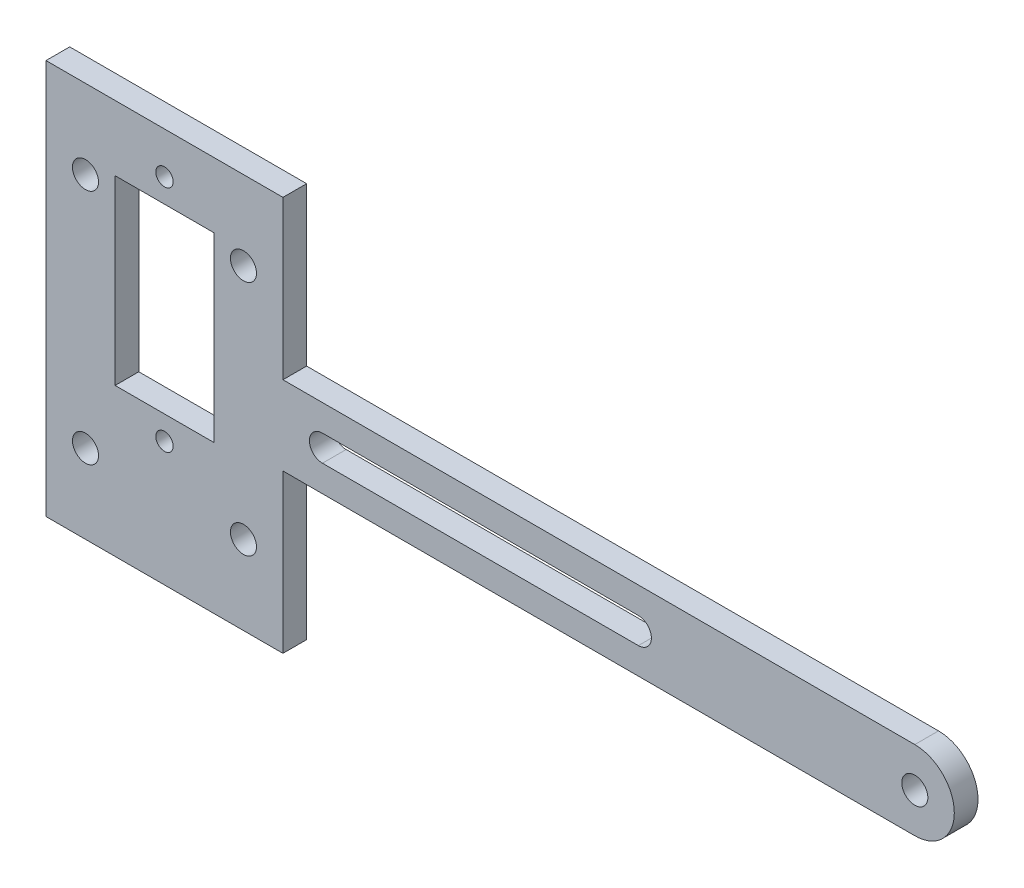
ISO-10303-21;
HEADER;
FILE_DESCRIPTION(('STEP AP214'),'2;1');
FILE_NAME('part.step','',(''),(''),'','','');
FILE_SCHEMA(('AUTOMOTIVE_DESIGN { 1 0 10303 214 1 1 1 1 }'));
ENDSEC;
DATA;
#1=APPLICATION_CONTEXT('core data for automotive mechanical design processes');
#2=APPLICATION_PROTOCOL_DEFINITION('international standard','automotive_design',2000,#1);
#3=PRODUCT_CONTEXT('',#1,'mechanical');
#4=PRODUCT('Part','Part','',(#3));
#5=PRODUCT_RELATED_PRODUCT_CATEGORY('part','',(#4));
#6=PRODUCT_DEFINITION_FORMATION('','',#4);
#7=PRODUCT_DEFINITION_CONTEXT('part definition',#1,'design');
#8=PRODUCT_DEFINITION('design','',#6,#7);
#9=PRODUCT_DEFINITION_SHAPE('','',#8);
#10=(LENGTH_UNIT() NAMED_UNIT(*) SI_UNIT(.MILLI.,.METRE.));
#11=(NAMED_UNIT(*) PLANE_ANGLE_UNIT() SI_UNIT($,.RADIAN.));
#12=(NAMED_UNIT(*) SI_UNIT($,.STERADIAN.) SOLID_ANGLE_UNIT());
#13=UNCERTAINTY_MEASURE_WITH_UNIT(LENGTH_MEASURE(1.E-05),#10,'distance_accuracy_value','');
#14=(GEOMETRIC_REPRESENTATION_CONTEXT(3) GLOBAL_UNCERTAINTY_ASSIGNED_CONTEXT((#13)) GLOBAL_UNIT_ASSIGNED_CONTEXT((#10,
#11,#12)) REPRESENTATION_CONTEXT('',''));
#15=CARTESIAN_POINT('',(0.,0.,0.));
#16=DIRECTION('',(0.,0.,1.));
#17=DIRECTION('',(1.,0.,0.));
#18=AXIS2_PLACEMENT_3D('',#15,#16,#17);
#19=CARTESIAN_POINT('',(95.,0.,3.));
#20=DIRECTION('',(0.,0.,1.));
#21=DIRECTION('',(1.,0.,0.));
#22=AXIS2_PLACEMENT_3D('',#19,#20,#21);
#23=PLANE('',#22);
#24=CARTESIAN_POINT('',(10.,-15.,3.));
#25=DIRECTION('',(0.,0.,1.));
#26=DIRECTION('',(-1.,0.,0.));
#27=AXIS2_PLACEMENT_3D('',#24,#25,#26);
#28=CIRCLE('',#27,1.65);
#29=CARTESIAN_POINT('',(8.35,-15.,3.));
#30=VERTEX_POINT('',#29);
#31=EDGE_CURVE('E431',#30,#30,#28,.T.);
#32=ORIENTED_EDGE('',*,*,#31,.F.);
#33=EDGE_LOOP('',(#32));
#34=FACE_BOUND('',#33,.T.);
#35=CARTESIAN_POINT('',(10.,15.,3.));
#36=DIRECTION('',(0.,0.,1.));
#37=DIRECTION('',(1.,0.,0.));
#38=AXIS2_PLACEMENT_3D('',#35,#36,#37);
#39=CIRCLE('',#38,1.65);
#40=CARTESIAN_POINT('',(11.65,15.,3.));
#41=VERTEX_POINT('',#40);
#42=EDGE_CURVE('E443',#41,#41,#39,.T.);
#43=ORIENTED_EDGE('',*,*,#42,.F.);
#44=EDGE_LOOP('',(#43));
#45=FACE_BOUND('',#44,.T.);
#46=DIRECTION('',(1.,0.,0.));
#47=VECTOR('',#46,1.);
#48=CARTESIAN_POINT('',(20.,-1.65,3.));
#49=LINE('',#48,#47);
#50=CARTESIAN_POINT('',(20.,-1.65,3.));
#51=VERTEX_POINT('',#50);
#52=CARTESIAN_POINT('',(60.,-1.65,3.));
#53=VERTEX_POINT('',#52);
#54=EDGE_CURVE('E158',#51,#53,#49,.T.);
#55=ORIENTED_EDGE('',*,*,#54,.F.);
#56=CARTESIAN_POINT('',(20.,0.,3.));
#57=DIRECTION('',(0.,0.,1.));
#58=DIRECTION('',(-1.,0.,0.));
#59=AXIS2_PLACEMENT_3D('',#56,#57,#58);
#60=CIRCLE('',#59,1.65);
#61=CARTESIAN_POINT('',(20.,1.65,3.));
#62=VERTEX_POINT('',#61);
#63=EDGE_CURVE('E150',#62,#51,#60,.T.);
#64=ORIENTED_EDGE('',*,*,#63,.F.);
#65=DIRECTION('',(-1.,0.,0.));
#66=VECTOR('',#65,1.);
#67=CARTESIAN_POINT('',(20.,1.65,3.));
#68=LINE('',#67,#66);
#69=CARTESIAN_POINT('',(60.,1.65,3.));
#70=VERTEX_POINT('',#69);
#71=EDGE_CURVE('E173',#70,#62,#68,.T.);
#72=ORIENTED_EDGE('',*,*,#71,.F.);
#73=CARTESIAN_POINT('',(60.,0.,3.));
#74=DIRECTION('',(0.,0.,1.));
#75=DIRECTION('',(-1.,0.,0.));
#76=AXIS2_PLACEMENT_3D('',#73,#74,#75);
#77=CIRCLE('',#76,1.65);
#78=EDGE_CURVE('E171',#53,#70,#77,.T.);
#79=ORIENTED_EDGE('',*,*,#78,.F.);
#80=EDGE_LOOP('',(#55,#64,#72,#79));
#81=FACE_BOUND('',#80,.T.);
#82=CARTESIAN_POINT('',(0.,19.75,3.));
#83=DIRECTION('',(0.,0.,1.));
#84=DIRECTION('',(1.,0.,0.));
#85=AXIS2_PLACEMENT_3D('',#82,#83,#84);
#86=CIRCLE('',#85,1.1);
#87=CARTESIAN_POINT('',(1.1,19.75,3.));
#88=VERTEX_POINT('',#87);
#89=EDGE_CURVE('E189',#88,#88,#86,.T.);
#90=ORIENTED_EDGE('',*,*,#89,.F.);
#91=EDGE_LOOP('',(#90));
#92=FACE_BOUND('',#91,.T.);
#93=DIRECTION('',(0.,1.,0.));
#94=VECTOR('',#93,1.);
#95=CARTESIAN_POINT('',(6.25,-6.25,3.));
#96=LINE('',#95,#94);
#97=CARTESIAN_POINT('',(6.25,-6.25,3.));
#98=VERTEX_POINT('',#97);
#99=CARTESIAN_POINT('',(6.25,16.75,3.));
#100=VERTEX_POINT('',#99);
#101=EDGE_CURVE('E203',#98,#100,#96,.T.);
#102=ORIENTED_EDGE('',*,*,#101,.F.);
#103=DIRECTION('',(1.,0.,0.));
#104=VECTOR('',#103,1.);
#105=CARTESIAN_POINT('',(-6.25,-6.25,3.));
#106=LINE('',#105,#104);
#107=CARTESIAN_POINT('',(-6.25,-6.25,3.));
#108=VERTEX_POINT('',#107);
#109=EDGE_CURVE('E201',#108,#98,#106,.T.);
#110=ORIENTED_EDGE('',*,*,#109,.F.);
#111=DIRECTION('',(0.,-1.,0.));
#112=VECTOR('',#111,1.);
#113=CARTESIAN_POINT('',(-6.25,16.75,3.));
#114=LINE('',#113,#112);
#115=CARTESIAN_POINT('',(-6.25000000000001,16.75,3.));
#116=VERTEX_POINT('',#115);
#117=EDGE_CURVE('E209',#116,#108,#114,.T.);
#118=ORIENTED_EDGE('',*,*,#117,.F.);
#119=DIRECTION('',(-1.,0.,0.));
#120=VECTOR('',#119,1.);
#121=CARTESIAN_POINT('',(6.25,16.75,3.));
#122=LINE('',#121,#120);
#123=EDGE_CURVE('E206',#100,#116,#122,.T.);
#124=ORIENTED_EDGE('',*,*,#123,.F.);
#125=EDGE_LOOP('',(#102,#110,#118,#124));
#126=FACE_BOUND('',#125,.T.);
#127=DIRECTION('',(1.,0.,0.));
#128=VECTOR('',#127,1.);
#129=CARTESIAN_POINT('',(-15.,-25.,3.));
#130=LINE('',#129,#128);
#131=CARTESIAN_POINT('',(-15.,-25.,3.));
#132=VERTEX_POINT('',#131);
#133=CARTESIAN_POINT('',(15.,-25.,3.));
#134=VERTEX_POINT('',#133);
#135=EDGE_CURVE('E232',#132,#134,#130,.T.);
#136=ORIENTED_EDGE('',*,*,#135,.T.);
#137=DIRECTION('',(0.,1.,0.));
#138=VECTOR('',#137,1.);
#139=CARTESIAN_POINT('',(15.,-25.,3.));
#140=LINE('',#139,#138);
#141=CARTESIAN_POINT('',(15.,-5.,3.));
#142=VERTEX_POINT('',#141);
#143=EDGE_CURVE('E235',#134,#142,#140,.T.);
#144=ORIENTED_EDGE('',*,*,#143,.T.);
#145=DIRECTION('',(1.,0.,0.));
#146=VECTOR('',#145,1.);
#147=CARTESIAN_POINT('',(15.,-5.,3.));
#148=LINE('',#147,#146);
#149=CARTESIAN_POINT('',(95.,-5.,3.));
#150=VERTEX_POINT('',#149);
#151=EDGE_CURVE('E238',#142,#150,#148,.T.);
#152=ORIENTED_EDGE('',*,*,#151,.T.);
#153=CARTESIAN_POINT('',(95.,0.,3.));
#154=DIRECTION('',(0.,0.,1.));
#155=DIRECTION('',(1.,0.,0.));
#156=AXIS2_PLACEMENT_3D('',#153,#154,#155);
#157=CIRCLE('',#156,5.);
#158=CARTESIAN_POINT('',(95.,5.,3.));
#159=VERTEX_POINT('',#158);
#160=EDGE_CURVE('E240',#150,#159,#157,.T.);
#161=ORIENTED_EDGE('',*,*,#160,.T.);
#162=DIRECTION('',(-1.,0.,0.));
#163=VECTOR('',#162,1.);
#164=CARTESIAN_POINT('',(95.,5.,3.));
#165=LINE('',#164,#163);
#166=CARTESIAN_POINT('',(15.,5.,3.));
#167=VERTEX_POINT('',#166);
#168=EDGE_CURVE('E242',#159,#167,#165,.T.);
#169=ORIENTED_EDGE('',*,*,#168,.T.);
#170=DIRECTION('',(0.,1.,0.));
#171=VECTOR('',#170,1.);
#172=CARTESIAN_POINT('',(15.,5.,3.));
#173=LINE('',#172,#171);
#174=CARTESIAN_POINT('',(15.,25.,3.));
#175=VERTEX_POINT('',#174);
#176=EDGE_CURVE('E244',#167,#175,#173,.T.);
#177=ORIENTED_EDGE('',*,*,#176,.T.);
#178=DIRECTION('',(-1.,0.,0.));
#179=VECTOR('',#178,1.);
#180=CARTESIAN_POINT('',(15.,25.,3.));
#181=LINE('',#180,#179);
#182=CARTESIAN_POINT('',(-15.,25.,3.));
#183=VERTEX_POINT('',#182);
#184=EDGE_CURVE('E246',#175,#183,#181,.T.);
#185=ORIENTED_EDGE('',*,*,#184,.T.);
#186=DIRECTION('',(0.,-1.,0.));
#187=VECTOR('',#186,1.);
#188=CARTESIAN_POINT('',(-15.,25.,3.));
#189=LINE('',#188,#187);
#190=EDGE_CURVE('E248',#183,#132,#189,.T.);
#191=ORIENTED_EDGE('',*,*,#190,.T.);
#192=EDGE_LOOP('',(#136,#144,#152,#161,#169,#177,#185,#191));
#193=FACE_BOUND('',#192,.T.);
#194=CARTESIAN_POINT('',(0.,-9.25,3.));
#195=DIRECTION('',(0.,0.,1.));
#196=DIRECTION('',(1.,0.,0.));
#197=AXIS2_PLACEMENT_3D('',#194,#195,#196);
#198=CIRCLE('',#197,1.1);
#199=CARTESIAN_POINT('',(1.1,-9.25,3.));
#200=VERTEX_POINT('',#199);
#201=EDGE_CURVE('E195',#200,#200,#198,.T.);
#202=ORIENTED_EDGE('',*,*,#201,.F.);
#203=EDGE_LOOP('',(#202));
#204=FACE_BOUND('',#203,.T.);
#205=CARTESIAN_POINT('',(95.,0.,3.));
#206=DIRECTION('',(0.,0.,1.));
#207=DIRECTION('',(1.,0.,0.));
#208=AXIS2_PLACEMENT_3D('',#205,#206,#207);
#209=CIRCLE('',#208,1.65);
#210=CARTESIAN_POINT('',(96.65,0.,3.));
#211=VERTEX_POINT('',#210);
#212=EDGE_CURVE('E179',#211,#211,#209,.T.);
#213=ORIENTED_EDGE('',*,*,#212,.F.);
#214=EDGE_LOOP('',(#213));
#215=FACE_BOUND('',#214,.T.);
#216=CARTESIAN_POINT('',(-9.99999999999999,14.9999999999999,3.));
#217=DIRECTION('',(0.,0.,1.));
#218=DIRECTION('',(1.,0.,0.));
#219=AXIS2_PLACEMENT_3D('',#216,#217,#218);
#220=CIRCLE('',#219,1.65);
#221=CARTESIAN_POINT('',(-8.34999999999999,14.9999999999999,3.));
#222=VERTEX_POINT('',#221);
#223=EDGE_CURVE('E437',#222,#222,#220,.T.);
#224=ORIENTED_EDGE('',*,*,#223,.F.);
#225=EDGE_LOOP('',(#224));
#226=FACE_BOUND('',#225,.T.);
#227=CARTESIAN_POINT('',(-9.99999999999999,-14.9999999999999,3.));
#228=DIRECTION('',(0.,0.,1.));
#229=DIRECTION('',(-1.,0.,0.));
#230=AXIS2_PLACEMENT_3D('',#227,#228,#229);
#231=CIRCLE('',#230,1.65);
#232=CARTESIAN_POINT('',(-11.65,-14.9999999999999,3.));
#233=VERTEX_POINT('',#232);
#234=EDGE_CURVE('E422',#233,#233,#231,.T.);
#235=ORIENTED_EDGE('',*,*,#234,.F.);
#236=EDGE_LOOP('',(#235));
#237=FACE_BOUND('',#236,.T.);
#238=ADVANCED_FACE('F37',(#34,#45,#81,#92,#126,#193,#204,#215,#226,#237),#23,.T.);
#239=CARTESIAN_POINT('',(95.,0.,0.));
#240=DIRECTION('',(0.,0.,1.));
#241=DIRECTION('',(1.,0.,0.));
#242=AXIS2_PLACEMENT_3D('',#239,#240,#241);
#243=PLANE('',#242);
#244=CARTESIAN_POINT('',(0.,19.75,0.));
#245=DIRECTION('',(0.,0.,1.));
#246=DIRECTION('',(1.,0.,0.));
#247=AXIS2_PLACEMENT_3D('',#244,#245,#246);
#248=CIRCLE('',#247,1.1);
#249=CARTESIAN_POINT('',(1.1,19.75,0.));
#250=VERTEX_POINT('',#249);
#251=EDGE_CURVE('E166',#250,#250,#248,.T.);
#252=ORIENTED_EDGE('',*,*,#251,.T.);
#253=EDGE_LOOP('',(#252));
#254=FACE_BOUND('',#253,.T.);
#255=CARTESIAN_POINT('',(0.,-9.25,0.));
#256=DIRECTION('',(0.,0.,1.));
#257=DIRECTION('',(1.,0.,0.));
#258=AXIS2_PLACEMENT_3D('',#255,#256,#257);
#259=CIRCLE('',#258,1.1);
#260=CARTESIAN_POINT('',(1.1,-9.25,0.));
#261=VERTEX_POINT('',#260);
#262=EDGE_CURVE('E192',#261,#261,#259,.T.);
#263=ORIENTED_EDGE('',*,*,#262,.T.);
#264=EDGE_LOOP('',(#263));
#265=FACE_BOUND('',#264,.T.);
#266=DIRECTION('',(1.,0.,0.));
#267=VECTOR('',#266,1.);
#268=CARTESIAN_POINT('',(-6.25,-6.25,0.));
#269=LINE('',#268,#267);
#270=CARTESIAN_POINT('',(-6.25,-6.25,0.));
#271=VERTEX_POINT('',#270);
#272=CARTESIAN_POINT('',(6.25,-6.25,0.));
#273=VERTEX_POINT('',#272);
#274=EDGE_CURVE('E198',#271,#273,#269,.T.);
#275=ORIENTED_EDGE('',*,*,#274,.T.);
#276=DIRECTION('',(0.,1.,0.));
#277=VECTOR('',#276,1.);
#278=CARTESIAN_POINT('',(6.25,-6.25,0.));
#279=LINE('',#278,#277);
#280=CARTESIAN_POINT('',(6.25,16.75,0.));
#281=VERTEX_POINT('',#280);
#282=EDGE_CURVE('E214',#273,#281,#279,.T.);
#283=ORIENTED_EDGE('',*,*,#282,.T.);
#284=DIRECTION('',(-1.,0.,0.));
#285=VECTOR('',#284,1.);
#286=CARTESIAN_POINT('',(6.25,16.75,0.));
#287=LINE('',#286,#285);
#288=CARTESIAN_POINT('',(-6.25,16.75,0.));
#289=VERTEX_POINT('',#288);
#290=EDGE_CURVE('E217',#281,#289,#287,.T.);
#291=ORIENTED_EDGE('',*,*,#290,.T.);
#292=DIRECTION('',(0.,-1.,0.));
#293=VECTOR('',#292,1.);
#294=CARTESIAN_POINT('',(-6.25,16.75,0.));
#295=LINE('',#294,#293);
#296=EDGE_CURVE('E204',#289,#271,#295,.T.);
#297=ORIENTED_EDGE('',*,*,#296,.T.);
#298=EDGE_LOOP('',(#275,#283,#291,#297));
#299=FACE_BOUND('',#298,.T.);
#300=DIRECTION('',(1.,0.,0.));
#301=VECTOR('',#300,1.);
#302=CARTESIAN_POINT('',(-15.,-25.,0.));
#303=LINE('',#302,#301);
#304=CARTESIAN_POINT('',(-15.,-25.,0.));
#305=VERTEX_POINT('',#304);
#306=CARTESIAN_POINT('',(15.,-25.,0.));
#307=VERTEX_POINT('',#306);
#308=EDGE_CURVE('E231',#305,#307,#303,.T.);
#309=ORIENTED_EDGE('',*,*,#308,.F.);
#310=DIRECTION('',(0.,-1.,0.));
#311=VECTOR('',#310,1.);
#312=CARTESIAN_POINT('',(-15.,25.,0.));
#313=LINE('',#312,#311);
#314=CARTESIAN_POINT('',(-15.,25.,0.));
#315=VERTEX_POINT('',#314);
#316=EDGE_CURVE('E236',#315,#305,#313,.T.);
#317=ORIENTED_EDGE('',*,*,#316,.F.);
#318=DIRECTION('',(-1.,0.,0.));
#319=VECTOR('',#318,1.);
#320=CARTESIAN_POINT('',(15.,25.,0.));
#321=LINE('',#320,#319);
#322=CARTESIAN_POINT('',(15.,25.,0.));
#323=VERTEX_POINT('',#322);
#324=EDGE_CURVE('E263',#323,#315,#321,.T.);
#325=ORIENTED_EDGE('',*,*,#324,.F.);
#326=DIRECTION('',(0.,1.,0.));
#327=VECTOR('',#326,1.);
#328=CARTESIAN_POINT('',(15.,5.,0.));
#329=LINE('',#328,#327);
#330=CARTESIAN_POINT('',(15.,5.,0.));
#331=VERTEX_POINT('',#330);
#332=EDGE_CURVE('E261',#331,#323,#329,.T.);
#333=ORIENTED_EDGE('',*,*,#332,.F.);
#334=DIRECTION('',(-1.,0.,0.));
#335=VECTOR('',#334,1.);
#336=CARTESIAN_POINT('',(95.,5.,0.));
#337=LINE('',#336,#335);
#338=CARTESIAN_POINT('',(95.,5.,0.));
#339=VERTEX_POINT('',#338);
#340=EDGE_CURVE('E259',#339,#331,#337,.T.);
#341=ORIENTED_EDGE('',*,*,#340,.F.);
#342=CARTESIAN_POINT('',(95.,0.,0.));
#343=DIRECTION('',(0.,0.,1.));
#344=DIRECTION('',(1.,0.,0.));
#345=AXIS2_PLACEMENT_3D('',#342,#343,#344);
#346=CIRCLE('',#345,5.);
#347=CARTESIAN_POINT('',(95.,-5.,0.));
#348=VERTEX_POINT('',#347);
#349=EDGE_CURVE('E257',#348,#339,#346,.T.);
#350=ORIENTED_EDGE('',*,*,#349,.F.);
#351=DIRECTION('',(1.,0.,0.));
#352=VECTOR('',#351,1.);
#353=CARTESIAN_POINT('',(15.,-5.,0.));
#354=LINE('',#353,#352);
#355=CARTESIAN_POINT('',(15.,-5.,0.));
#356=VERTEX_POINT('',#355);
#357=EDGE_CURVE('E255',#356,#348,#354,.T.);
#358=ORIENTED_EDGE('',*,*,#357,.F.);
#359=DIRECTION('',(0.,1.,0.));
#360=VECTOR('',#359,1.);
#361=CARTESIAN_POINT('',(15.,-25.,0.));
#362=LINE('',#361,#360);
#363=EDGE_CURVE('E253',#307,#356,#362,.T.);
#364=ORIENTED_EDGE('',*,*,#363,.F.);
#365=EDGE_LOOP('',(#309,#317,#325,#333,#341,#350,#358,#364));
#366=FACE_BOUND('',#365,.T.);
#367=CARTESIAN_POINT('',(20.,0.,0.));
#368=DIRECTION('',(0.,0.,1.));
#369=DIRECTION('',(-1.,0.,0.));
#370=AXIS2_PLACEMENT_3D('',#367,#368,#369);
#371=CIRCLE('',#370,1.65);
#372=CARTESIAN_POINT('',(20.,1.65,0.));
#373=VERTEX_POINT('',#372);
#374=CARTESIAN_POINT('',(20.,-1.65,0.));
#375=VERTEX_POINT('',#374);
#376=EDGE_CURVE('E60',#373,#375,#371,.T.);
#377=ORIENTED_EDGE('',*,*,#376,.T.);
#378=DIRECTION('',(1.,0.,0.));
#379=VECTOR('',#378,1.);
#380=CARTESIAN_POINT('',(20.,-1.65,0.));
#381=LINE('',#380,#379);
#382=CARTESIAN_POINT('',(60.,-1.65,0.));
#383=VERTEX_POINT('',#382);
#384=EDGE_CURVE('E165',#375,#383,#381,.T.);
#385=ORIENTED_EDGE('',*,*,#384,.T.);
#386=CARTESIAN_POINT('',(60.,0.,0.));
#387=DIRECTION('',(0.,0.,1.));
#388=DIRECTION('',(-1.,0.,0.));
#389=AXIS2_PLACEMENT_3D('',#386,#387,#388);
#390=CIRCLE('',#389,1.65);
#391=CARTESIAN_POINT('',(60.,1.65,0.));
#392=VERTEX_POINT('',#391);
#393=EDGE_CURVE('E181',#383,#392,#390,.T.);
#394=ORIENTED_EDGE('',*,*,#393,.T.);
#395=DIRECTION('',(-1.,0.,0.));
#396=VECTOR('',#395,1.);
#397=CARTESIAN_POINT('',(20.,1.65,0.));
#398=LINE('',#397,#396);
#399=EDGE_CURVE('E159',#392,#373,#398,.T.);
#400=ORIENTED_EDGE('',*,*,#399,.T.);
#401=EDGE_LOOP('',(#377,#385,#394,#400));
#402=FACE_BOUND('',#401,.T.);
#403=CARTESIAN_POINT('',(95.,0.,0.));
#404=DIRECTION('',(0.,0.,1.));
#405=DIRECTION('',(1.,0.,0.));
#406=AXIS2_PLACEMENT_3D('',#403,#404,#405);
#407=CIRCLE('',#406,1.65);
#408=CARTESIAN_POINT('',(96.65,0.,0.));
#409=VERTEX_POINT('',#408);
#410=EDGE_CURVE('E446',#409,#409,#407,.T.);
#411=ORIENTED_EDGE('',*,*,#410,.T.);
#412=EDGE_LOOP('',(#411));
#413=FACE_BOUND('',#412,.T.);
#414=CARTESIAN_POINT('',(10.,15.,0.));
#415=DIRECTION('',(0.,0.,1.));
#416=DIRECTION('',(1.,0.,0.));
#417=AXIS2_PLACEMENT_3D('',#414,#415,#416);
#418=CIRCLE('',#417,1.65);
#419=CARTESIAN_POINT('',(11.65,15.,0.));
#420=VERTEX_POINT('',#419);
#421=EDGE_CURVE('E440',#420,#420,#418,.T.);
#422=ORIENTED_EDGE('',*,*,#421,.T.);
#423=EDGE_LOOP('',(#422));
#424=FACE_BOUND('',#423,.T.);
#425=CARTESIAN_POINT('',(-9.99999999999999,14.9999999999999,0.));
#426=DIRECTION('',(0.,0.,1.));
#427=DIRECTION('',(1.,0.,0.));
#428=AXIS2_PLACEMENT_3D('',#425,#426,#427);
#429=CIRCLE('',#428,1.65);
#430=CARTESIAN_POINT('',(-8.34999999999999,14.9999999999999,0.));
#431=VERTEX_POINT('',#430);
#432=EDGE_CURVE('E434',#431,#431,#429,.T.);
#433=ORIENTED_EDGE('',*,*,#432,.T.);
#434=EDGE_LOOP('',(#433));
#435=FACE_BOUND('',#434,.T.);
#436=CARTESIAN_POINT('',(10.,-15.,0.));
#437=DIRECTION('',(0.,0.,1.));
#438=DIRECTION('',(-1.,0.,0.));
#439=AXIS2_PLACEMENT_3D('',#436,#437,#438);
#440=CIRCLE('',#439,1.65);
#441=CARTESIAN_POINT('',(8.35,-15.,0.));
#442=VERTEX_POINT('',#441);
#443=EDGE_CURVE('E428',#442,#442,#440,.T.);
#444=ORIENTED_EDGE('',*,*,#443,.T.);
#445=EDGE_LOOP('',(#444));
#446=FACE_BOUND('',#445,.T.);
#447=CARTESIAN_POINT('',(-9.99999999999999,-14.9999999999999,0.));
#448=DIRECTION('',(0.,0.,1.));
#449=DIRECTION('',(-1.,0.,0.));
#450=AXIS2_PLACEMENT_3D('',#447,#448,#449);
#451=CIRCLE('',#450,1.65);
#452=CARTESIAN_POINT('',(-11.65,-14.9999999999999,0.));
#453=VERTEX_POINT('',#452);
#454=EDGE_CURVE('E425',#453,#453,#451,.T.);
#455=ORIENTED_EDGE('',*,*,#454,.T.);
#456=EDGE_LOOP('',(#455));
#457=FACE_BOUND('',#456,.T.);
#458=ADVANCED_FACE('F293',(#254,#265,#299,#366,#402,#413,#424,#435,#446,#457),#243,.F.);
#459=CARTESIAN_POINT('',(-15.,-25.,3.));
#460=DIRECTION('',(0.,1.,0.));
#461=DIRECTION('',(0.,0.,1.));
#462=AXIS2_PLACEMENT_3D('',#459,#460,#461);
#463=PLANE('',#462);
#464=ORIENTED_EDGE('',*,*,#308,.T.);
#465=DIRECTION('',(0.,0.,-1.));
#466=VECTOR('',#465,1.);
#467=CARTESIAN_POINT('',(15.,-25.,3.));
#468=LINE('',#467,#466);
#469=EDGE_CURVE('E11',#134,#307,#468,.T.);
#470=ORIENTED_EDGE('',*,*,#469,.F.);
#471=ORIENTED_EDGE('',*,*,#135,.F.);
#472=DIRECTION('',(0.,0.,-1.));
#473=VECTOR('',#472,1.);
#474=CARTESIAN_POINT('',(-15.,-25.,3.));
#475=LINE('',#474,#473);
#476=EDGE_CURVE('E250',#132,#305,#475,.T.);
#477=ORIENTED_EDGE('',*,*,#476,.T.);
#478=EDGE_LOOP('',(#464,#470,#471,#477));
#479=FACE_BOUND('',#478,.T.);
#480=ADVANCED_FACE('F39',(#479),#463,.F.);
#481=CARTESIAN_POINT('',(15.,-25.,3.));
#482=DIRECTION('',(-1.,0.,0.));
#483=DIRECTION('',(0.,0.,1.));
#484=AXIS2_PLACEMENT_3D('',#481,#482,#483);
#485=PLANE('',#484);
#486=ORIENTED_EDGE('',*,*,#363,.T.);
#487=DIRECTION('',(0.,0.,-1.));
#488=VECTOR('',#487,1.);
#489=CARTESIAN_POINT('',(15.,-5.,3.));
#490=LINE('',#489,#488);
#491=EDGE_CURVE('E45',#142,#356,#490,.T.);
#492=ORIENTED_EDGE('',*,*,#491,.F.);
#493=ORIENTED_EDGE('',*,*,#143,.F.);
#494=ORIENTED_EDGE('',*,*,#469,.T.);
#495=EDGE_LOOP('',(#486,#492,#493,#494));
#496=FACE_BOUND('',#495,.T.);
#497=ADVANCED_FACE('F311',(#496),#485,.F.);
#498=CARTESIAN_POINT('',(15.,-5.,3.));
#499=DIRECTION('',(0.,1.,0.));
#500=DIRECTION('',(0.,0.,1.));
#501=AXIS2_PLACEMENT_3D('',#498,#499,#500);
#502=PLANE('',#501);
#503=ORIENTED_EDGE('',*,*,#357,.T.);
#504=DIRECTION('',(0.,0.,-1.));
#505=VECTOR('',#504,1.);
#506=CARTESIAN_POINT('',(95.,-5.,3.));
#507=LINE('',#506,#505);
#508=EDGE_CURVE('E280',#150,#348,#507,.T.);
#509=ORIENTED_EDGE('',*,*,#508,.F.);
#510=ORIENTED_EDGE('',*,*,#151,.F.);
#511=ORIENTED_EDGE('',*,*,#491,.T.);
#512=EDGE_LOOP('',(#503,#509,#510,#511));
#513=FACE_BOUND('',#512,.T.);
#514=ADVANCED_FACE('F287',(#513),#502,.F.);
#515=CARTESIAN_POINT('',(95.,0.,3.));
#516=DIRECTION('',(0.,0.,-1.));
#517=DIRECTION('',(-1.,0.,0.));
#518=AXIS2_PLACEMENT_3D('',#515,#516,#517);
#519=CYLINDRICAL_SURFACE('',#518,5.);
#520=ORIENTED_EDGE('',*,*,#349,.T.);
#521=DIRECTION('',(0.,0.,-1.));
#522=VECTOR('',#521,1.);
#523=CARTESIAN_POINT('',(95.,5.,3.));
#524=LINE('',#523,#522);
#525=EDGE_CURVE('E277',#159,#339,#524,.T.);
#526=ORIENTED_EDGE('',*,*,#525,.F.);
#527=ORIENTED_EDGE('',*,*,#160,.F.);
#528=ORIENTED_EDGE('',*,*,#508,.T.);
#529=EDGE_LOOP('',(#520,#526,#527,#528));
#530=FACE_BOUND('',#529,.T.);
#531=ADVANCED_FACE('F299',(#530),#519,.T.);
#532=CARTESIAN_POINT('',(95.,5.,3.));
#533=DIRECTION('',(0.,-1.,0.));
#534=DIRECTION('',(1.,0.,0.));
#535=AXIS2_PLACEMENT_3D('',#532,#533,#534);
#536=PLANE('',#535);
#537=ORIENTED_EDGE('',*,*,#340,.T.);
#538=DIRECTION('',(0.,0.,-1.));
#539=VECTOR('',#538,1.);
#540=CARTESIAN_POINT('',(15.,5.,3.));
#541=LINE('',#540,#539);
#542=EDGE_CURVE('E274',#167,#331,#541,.T.);
#543=ORIENTED_EDGE('',*,*,#542,.F.);
#544=ORIENTED_EDGE('',*,*,#168,.F.);
#545=ORIENTED_EDGE('',*,*,#525,.T.);
#546=EDGE_LOOP('',(#537,#543,#544,#545));
#547=FACE_BOUND('',#546,.T.);
#548=ADVANCED_FACE('F303',(#547),#536,.F.);
#549=CARTESIAN_POINT('',(15.,5.,3.));
#550=DIRECTION('',(-1.,0.,0.));
#551=DIRECTION('',(0.,0.,1.));
#552=AXIS2_PLACEMENT_3D('',#549,#550,#551);
#553=PLANE('',#552);
#554=ORIENTED_EDGE('',*,*,#332,.T.);
#555=DIRECTION('',(0.,0.,-1.));
#556=VECTOR('',#555,1.);
#557=CARTESIAN_POINT('',(15.,25.,3.));
#558=LINE('',#557,#556);
#559=EDGE_CURVE('E271',#175,#323,#558,.T.);
#560=ORIENTED_EDGE('',*,*,#559,.F.);
#561=ORIENTED_EDGE('',*,*,#176,.F.);
#562=ORIENTED_EDGE('',*,*,#542,.T.);
#563=EDGE_LOOP('',(#554,#560,#561,#562));
#564=FACE_BOUND('',#563,.T.);
#565=ADVANCED_FACE('F324',(#564),#553,.F.);
#566=CARTESIAN_POINT('',(15.,25.,3.));
#567=DIRECTION('',(0.,-1.,0.));
#568=DIRECTION('',(1.,0.,0.));
#569=AXIS2_PLACEMENT_3D('',#566,#567,#568);
#570=PLANE('',#569);
#571=ORIENTED_EDGE('',*,*,#324,.T.);
#572=DIRECTION('',(0.,0.,-1.));
#573=VECTOR('',#572,1.);
#574=CARTESIAN_POINT('',(-15.,25.,3.));
#575=LINE('',#574,#573);
#576=EDGE_CURVE('E268',#183,#315,#575,.T.);
#577=ORIENTED_EDGE('',*,*,#576,.F.);
#578=ORIENTED_EDGE('',*,*,#184,.F.);
#579=ORIENTED_EDGE('',*,*,#559,.T.);
#580=EDGE_LOOP('',(#571,#577,#578,#579));
#581=FACE_BOUND('',#580,.T.);
#582=ADVANCED_FACE('F322',(#581),#570,.F.);
#583=CARTESIAN_POINT('',(-15.,25.,3.));
#584=DIRECTION('',(1.,0.,0.));
#585=DIRECTION('',(0.,1.,0.));
#586=AXIS2_PLACEMENT_3D('',#583,#584,#585);
#587=PLANE('',#586);
#588=ORIENTED_EDGE('',*,*,#316,.T.);
#589=ORIENTED_EDGE('',*,*,#476,.F.);
#590=ORIENTED_EDGE('',*,*,#190,.F.);
#591=ORIENTED_EDGE('',*,*,#576,.T.);
#592=EDGE_LOOP('',(#588,#589,#590,#591));
#593=FACE_BOUND('',#592,.T.);
#594=ADVANCED_FACE('F317',(#593),#587,.F.);
#595=CARTESIAN_POINT('',(-6.25,-6.25,3.));
#596=DIRECTION('',(0.,1.,0.));
#597=DIRECTION('',(0.,0.,1.));
#598=AXIS2_PLACEMENT_3D('',#595,#596,#597);
#599=PLANE('',#598);
#600=ORIENTED_EDGE('',*,*,#274,.F.);
#601=DIRECTION('',(0.,0.,-1.));
#602=VECTOR('',#601,1.);
#603=CARTESIAN_POINT('',(-6.25,-6.25,3.));
#604=LINE('',#603,#602);
#605=EDGE_CURVE('E211',#108,#271,#604,.T.);
#606=ORIENTED_EDGE('',*,*,#605,.F.);
#607=ORIENTED_EDGE('',*,*,#109,.T.);
#608=DIRECTION('',(0.,0.,-1.));
#609=VECTOR('',#608,1.);
#610=CARTESIAN_POINT('',(6.25,-6.25,3.));
#611=LINE('',#610,#609);
#612=EDGE_CURVE('E228',#98,#273,#611,.T.);
#613=ORIENTED_EDGE('',*,*,#612,.T.);
#614=EDGE_LOOP('',(#600,#606,#607,#613));
#615=FACE_BOUND('',#614,.T.);
#616=ADVANCED_FACE('F344',(#615),#599,.T.);
#617=CARTESIAN_POINT('',(6.25,-6.25,3.));
#618=DIRECTION('',(-1.,0.,0.));
#619=DIRECTION('',(0.,-1.,0.));
#620=AXIS2_PLACEMENT_3D('',#617,#618,#619);
#621=PLANE('',#620);
#622=ORIENTED_EDGE('',*,*,#282,.F.);
#623=ORIENTED_EDGE('',*,*,#612,.F.);
#624=ORIENTED_EDGE('',*,*,#101,.T.);
#625=DIRECTION('',(0.,0.,-1.));
#626=VECTOR('',#625,1.);
#627=CARTESIAN_POINT('',(6.25,16.75,3.));
#628=LINE('',#627,#626);
#629=EDGE_CURVE('E226',#100,#281,#628,.T.);
#630=ORIENTED_EDGE('',*,*,#629,.T.);
#631=EDGE_LOOP('',(#622,#623,#624,#630));
#632=FACE_BOUND('',#631,.T.);
#633=ADVANCED_FACE('F351',(#632),#621,.T.);
#634=CARTESIAN_POINT('',(6.25,16.75,3.));
#635=DIRECTION('',(0.,-1.,0.));
#636=DIRECTION('',(0.,0.,-1.));
#637=AXIS2_PLACEMENT_3D('',#634,#635,#636);
#638=PLANE('',#637);
#639=ORIENTED_EDGE('',*,*,#290,.F.);
#640=ORIENTED_EDGE('',*,*,#629,.F.);
#641=ORIENTED_EDGE('',*,*,#123,.T.);
#642=DIRECTION('',(0.,0.,-1.));
#643=VECTOR('',#642,1.);
#644=CARTESIAN_POINT('',(-6.25,16.75,3.));
#645=LINE('',#644,#643);
#646=EDGE_CURVE('E224',#116,#289,#645,.T.);
#647=ORIENTED_EDGE('',*,*,#646,.T.);
#648=EDGE_LOOP('',(#639,#640,#641,#647));
#649=FACE_BOUND('',#648,.T.);
#650=ADVANCED_FACE('F356',(#649),#638,.T.);
#651=CARTESIAN_POINT('',(-6.25,16.75,3.));
#652=DIRECTION('',(1.,0.,0.));
#653=DIRECTION('',(0.,1.,0.));
#654=AXIS2_PLACEMENT_3D('',#651,#652,#653);
#655=PLANE('',#654);
#656=ORIENTED_EDGE('',*,*,#296,.F.);
#657=ORIENTED_EDGE('',*,*,#646,.F.);
#658=ORIENTED_EDGE('',*,*,#117,.T.);
#659=ORIENTED_EDGE('',*,*,#605,.T.);
#660=EDGE_LOOP('',(#656,#657,#658,#659));
#661=FACE_BOUND('',#660,.T.);
#662=ADVANCED_FACE('F364',(#661),#655,.T.);
#663=CARTESIAN_POINT('',(0.,-9.25,3.));
#664=DIRECTION('',(0.,0.,-1.));
#665=DIRECTION('',(-1.,0.,0.));
#666=AXIS2_PLACEMENT_3D('',#663,#664,#665);
#667=CYLINDRICAL_SURFACE('',#666,1.1);
#668=ORIENTED_EDGE('',*,*,#201,.T.);
#669=EDGE_LOOP('',(#668));
#670=FACE_BOUND('',#669,.T.);
#671=ORIENTED_EDGE('',*,*,#262,.F.);
#672=EDGE_LOOP('',(#671));
#673=FACE_BOUND('',#672,.T.);
#674=ADVANCED_FACE('F377',(#670,#673),#667,.F.);
#675=CARTESIAN_POINT('',(0.,19.75,3.));
#676=DIRECTION('',(0.,0.,-1.));
#677=DIRECTION('',(-1.,0.,0.));
#678=AXIS2_PLACEMENT_3D('',#675,#676,#677);
#679=CYLINDRICAL_SURFACE('',#678,1.1);
#680=ORIENTED_EDGE('',*,*,#89,.T.);
#681=EDGE_LOOP('',(#680));
#682=FACE_BOUND('',#681,.T.);
#683=ORIENTED_EDGE('',*,*,#251,.F.);
#684=EDGE_LOOP('',(#683));
#685=FACE_BOUND('',#684,.T.);
#686=ADVANCED_FACE('F382',(#682,#685),#679,.F.);
#687=CARTESIAN_POINT('',(20.,0.,3.));
#688=DIRECTION('',(0.,0.,-1.));
#689=DIRECTION('',(-1.,0.,0.));
#690=AXIS2_PLACEMENT_3D('',#687,#688,#689);
#691=CYLINDRICAL_SURFACE('',#690,1.65);
#692=ORIENTED_EDGE('',*,*,#376,.F.);
#693=DIRECTION('',(0.,0.,-1.));
#694=VECTOR('',#693,1.);
#695=CARTESIAN_POINT('',(20.,1.65,3.));
#696=LINE('',#695,#694);
#697=EDGE_CURVE('E154',#62,#373,#696,.T.);
#698=ORIENTED_EDGE('',*,*,#697,.F.);
#699=ORIENTED_EDGE('',*,*,#63,.T.);
#700=DIRECTION('',(0.,0.,-1.));
#701=VECTOR('',#700,1.);
#702=CARTESIAN_POINT('',(20.,-1.65,3.));
#703=LINE('',#702,#701);
#704=EDGE_CURVE('E153',#51,#375,#703,.T.);
#705=ORIENTED_EDGE('',*,*,#704,.T.);
#706=EDGE_LOOP('',(#692,#698,#699,#705));
#707=FACE_BOUND('',#706,.T.);
#708=ADVANCED_FACE('F152',(#707),#691,.F.);
#709=CARTESIAN_POINT('',(20.,-1.65,3.));
#710=DIRECTION('',(0.,1.,0.));
#711=DIRECTION('',(0.,0.,1.));
#712=AXIS2_PLACEMENT_3D('',#709,#710,#711);
#713=PLANE('',#712);
#714=ORIENTED_EDGE('',*,*,#384,.F.);
#715=ORIENTED_EDGE('',*,*,#704,.F.);
#716=ORIENTED_EDGE('',*,*,#54,.T.);
#717=DIRECTION('',(0.,0.,-1.));
#718=VECTOR('',#717,1.);
#719=CARTESIAN_POINT('',(60.,-1.65,3.));
#720=LINE('',#719,#718);
#721=EDGE_CURVE('E167',#53,#383,#720,.T.);
#722=ORIENTED_EDGE('',*,*,#721,.T.);
#723=EDGE_LOOP('',(#714,#715,#716,#722));
#724=FACE_BOUND('',#723,.T.);
#725=ADVANCED_FACE('F162',(#724),#713,.T.);
#726=CARTESIAN_POINT('',(60.,0.,3.));
#727=DIRECTION('',(0.,0.,-1.));
#728=DIRECTION('',(-1.,0.,0.));
#729=AXIS2_PLACEMENT_3D('',#726,#727,#728);
#730=CYLINDRICAL_SURFACE('',#729,1.65);
#731=ORIENTED_EDGE('',*,*,#393,.F.);
#732=ORIENTED_EDGE('',*,*,#721,.F.);
#733=ORIENTED_EDGE('',*,*,#78,.T.);
#734=DIRECTION('',(0.,0.,-1.));
#735=VECTOR('',#734,1.);
#736=CARTESIAN_POINT('',(60.,1.65,3.));
#737=LINE('',#736,#735);
#738=EDGE_CURVE('E52',#70,#392,#737,.T.);
#739=ORIENTED_EDGE('',*,*,#738,.T.);
#740=EDGE_LOOP('',(#731,#732,#733,#739));
#741=FACE_BOUND('',#740,.T.);
#742=ADVANCED_FACE('F391',(#741),#730,.F.);
#743=CARTESIAN_POINT('',(20.,1.65,3.));
#744=DIRECTION('',(0.,-1.,0.));
#745=DIRECTION('',(0.,0.,-1.));
#746=AXIS2_PLACEMENT_3D('',#743,#744,#745);
#747=PLANE('',#746);
#748=ORIENTED_EDGE('',*,*,#399,.F.);
#749=ORIENTED_EDGE('',*,*,#738,.F.);
#750=ORIENTED_EDGE('',*,*,#71,.T.);
#751=ORIENTED_EDGE('',*,*,#697,.T.);
#752=EDGE_LOOP('',(#748,#749,#750,#751));
#753=FACE_BOUND('',#752,.T.);
#754=ADVANCED_FACE('F394',(#753),#747,.T.);
#755=CARTESIAN_POINT('',(95.,0.,3.));
#756=DIRECTION('',(0.,0.,-1.));
#757=DIRECTION('',(-1.,0.,0.));
#758=AXIS2_PLACEMENT_3D('',#755,#756,#757);
#759=CYLINDRICAL_SURFACE('',#758,1.65);
#760=ORIENTED_EDGE('',*,*,#212,.T.);
#761=EDGE_LOOP('',(#760));
#762=FACE_BOUND('',#761,.T.);
#763=ORIENTED_EDGE('',*,*,#410,.F.);
#764=EDGE_LOOP('',(#763));
#765=FACE_BOUND('',#764,.T.);
#766=ADVANCED_FACE('F398',(#762,#765),#759,.F.);
#767=CARTESIAN_POINT('',(10.,15.,3.));
#768=DIRECTION('',(0.,0.,-1.));
#769=DIRECTION('',(-1.,0.,0.));
#770=AXIS2_PLACEMENT_3D('',#767,#768,#769);
#771=CYLINDRICAL_SURFACE('',#770,1.65);
#772=ORIENTED_EDGE('',*,*,#42,.T.);
#773=EDGE_LOOP('',(#772));
#774=FACE_BOUND('',#773,.T.);
#775=ORIENTED_EDGE('',*,*,#421,.F.);
#776=EDGE_LOOP('',(#775));
#777=FACE_BOUND('',#776,.T.);
#778=ADVANCED_FACE('F401',(#774,#777),#771,.F.);
#779=CARTESIAN_POINT('',(-9.99999999999999,14.9999999999999,3.));
#780=DIRECTION('',(0.,0.,-1.));
#781=DIRECTION('',(-1.,0.,0.));
#782=AXIS2_PLACEMENT_3D('',#779,#780,#781);
#783=CYLINDRICAL_SURFACE('',#782,1.65);
#784=ORIENTED_EDGE('',*,*,#223,.T.);
#785=EDGE_LOOP('',(#784));
#786=FACE_BOUND('',#785,.T.);
#787=ORIENTED_EDGE('',*,*,#432,.F.);
#788=EDGE_LOOP('',(#787));
#789=FACE_BOUND('',#788,.T.);
#790=ADVANCED_FACE('F405',(#786,#789),#783,.F.);
#791=CARTESIAN_POINT('',(10.,-15.,3.));
#792=DIRECTION('',(0.,0.,-1.));
#793=DIRECTION('',(-1.,0.,0.));
#794=AXIS2_PLACEMENT_3D('',#791,#792,#793);
#795=CYLINDRICAL_SURFACE('',#794,1.65);
#796=ORIENTED_EDGE('',*,*,#31,.T.);
#797=EDGE_LOOP('',(#796));
#798=FACE_BOUND('',#797,.T.);
#799=ORIENTED_EDGE('',*,*,#443,.F.);
#800=EDGE_LOOP('',(#799));
#801=FACE_BOUND('',#800,.T.);
#802=ADVANCED_FACE('F409',(#798,#801),#795,.F.);
#803=CARTESIAN_POINT('',(-9.99999999999999,-14.9999999999999,3.));
#804=DIRECTION('',(0.,0.,-1.));
#805=DIRECTION('',(-1.,0.,0.));
#806=AXIS2_PLACEMENT_3D('',#803,#804,#805);
#807=CYLINDRICAL_SURFACE('',#806,1.65);
#808=ORIENTED_EDGE('',*,*,#234,.T.);
#809=EDGE_LOOP('',(#808));
#810=FACE_BOUND('',#809,.T.);
#811=ORIENTED_EDGE('',*,*,#454,.F.);
#812=EDGE_LOOP('',(#811));
#813=FACE_BOUND('',#812,.T.);
#814=ADVANCED_FACE('F413',(#810,#813),#807,.F.);
#815=CLOSED_SHELL('',(#238,#458,#480,#497,#514,#531,#548,#565,#582,#594,#616,#633,#650,#662,
#674,#686,#708,#725,#742,#754,#766,#778,#790,#802,#814));
#816=MANIFOLD_SOLID_BREP('B2',#815);
#817=ADVANCED_BREP_SHAPE_REPRESENTATION('',(#18,#816),#14);
#818=SHAPE_DEFINITION_REPRESENTATION(#9,#817);
ENDSEC;
END-ISO-10303-21;
